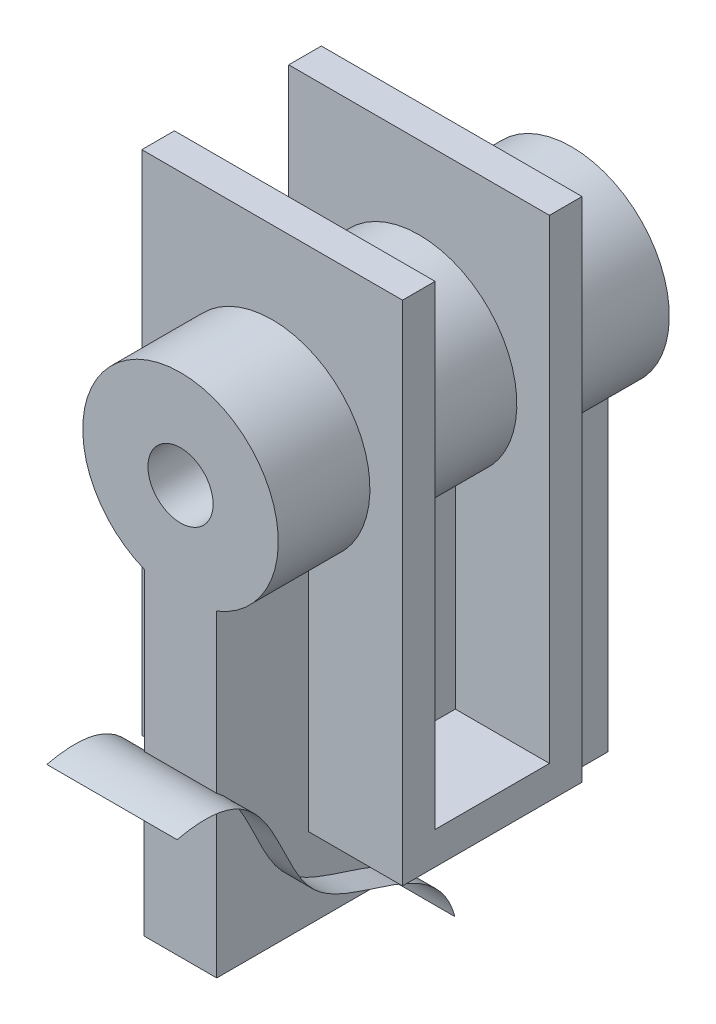
ISO-10303-21;
HEADER;
FILE_DESCRIPTION(('STEP AP214'),'2;1');
FILE_NAME('part.step','',(''),(''),'','','');
FILE_SCHEMA(('AUTOMOTIVE_DESIGN { 1 0 10303 214 1 1 1 1 }'));
ENDSEC;
DATA;
#1=APPLICATION_CONTEXT('core data for automotive mechanical design processes');
#2=APPLICATION_PROTOCOL_DEFINITION('international standard','automotive_design',2000,#1);
#3=PRODUCT_CONTEXT('',#1,'mechanical');
#4=PRODUCT('Part','Part','',(#3));
#5=PRODUCT_RELATED_PRODUCT_CATEGORY('part','',(#4));
#6=PRODUCT_DEFINITION_FORMATION('','',#4);
#7=PRODUCT_DEFINITION_CONTEXT('part definition',#1,'design');
#8=PRODUCT_DEFINITION('design','',#6,#7);
#9=PRODUCT_DEFINITION_SHAPE('','',#8);
#10=(LENGTH_UNIT() NAMED_UNIT(*) SI_UNIT(.MILLI.,.METRE.));
#11=(NAMED_UNIT(*) PLANE_ANGLE_UNIT() SI_UNIT($,.RADIAN.));
#12=(NAMED_UNIT(*) SI_UNIT($,.STERADIAN.) SOLID_ANGLE_UNIT());
#13=UNCERTAINTY_MEASURE_WITH_UNIT(LENGTH_MEASURE(1.E-05),#10,'distance_accuracy_value','');
#14=(GEOMETRIC_REPRESENTATION_CONTEXT(3) GLOBAL_UNCERTAINTY_ASSIGNED_CONTEXT((#13)) GLOBAL_UNIT_ASSIGNED_CONTEXT((#10,
#11,#12)) REPRESENTATION_CONTEXT('',''));
#15=CARTESIAN_POINT('',(0.,0.,0.));
#16=DIRECTION('',(0.,0.,1.));
#17=DIRECTION('',(1.,0.,0.));
#18=AXIS2_PLACEMENT_3D('',#15,#16,#17);
#19=CARTESIAN_POINT('',(0.,-36.8210870869659,40.5237731026121));
#20=CARTESIAN_POINT('',(0.,-33.3118553670702,25.1176072235687));
#21=CARTESIAN_POINT('',(0.,-61.7215890433346,26.7426652328646));
#22=CARTESIAN_POINT('',(0.,-57.8458147883083,0.702636395193637));
#23=CARTESIAN_POINT('',(0.,-68.3475748648418,-2.08737019533879));
#24=B_SPLINE_CURVE_WITH_KNOTS('',3,(#19,#20,#21,#22,#23),.UNSPECIFIED.,.F.,.F.,(4,1,4),(0.,
0.518621459530431,1.),.UNSPECIFIED.);
#25=DIRECTION('',(1.,0.,0.));
#26=VECTOR('',#25,1.);
#27=SURFACE_OF_LINEAR_EXTRUSION('',#24,#26);
#28=CARTESIAN_POINT('',(5.5776064521285,-36.8210870869659,40.5237731026121));
#29=CARTESIAN_POINT('',(5.5776064521285,-33.3118553670702,25.1176072235687));
#30=CARTESIAN_POINT('',(5.5776064521285,-61.7215890433346,26.7426652328646));
#31=CARTESIAN_POINT('',(5.5776064521285,-57.8458147883083,0.702636395193637));
#32=CARTESIAN_POINT('',(5.5776064521285,-68.3475748648418,-2.08737019533879));
#33=B_SPLINE_CURVE_WITH_KNOTS('',3,(#28,#29,#30,#31,#32),.UNSPECIFIED.,.F.,.F.,(4,1,4),(0.,
0.518621459530431,1.),.UNSPECIFIED.);
#34=CARTESIAN_POINT('',(5.5776064521285,-62.6622800075539,1.36688905202756));
#35=VERTEX_POINT('',#34);
#36=CARTESIAN_POINT('',(5.5776064521285,-38.1231716305938,30.02));
#37=VERTEX_POINT('',#36);
#38=EDGE_CURVE('E12',#35,#37,#33,.F.);
#39=ORIENTED_EDGE('',*,*,#38,.F.);
#40=DIRECTION('',(1.,0.,0.));
#41=VECTOR('',#40,1.);
#42=CARTESIAN_POINT('',(0.,-62.6622800075539,1.36688905202756));
#43=LINE('',#42,#41);
#44=CARTESIAN_POINT('',(-5.5776064521285,-62.6622800098763,1.36688904937728));
#45=VERTEX_POINT('',#44);
#46=EDGE_CURVE('E61',#45,#35,#43,.T.);
#47=ORIENTED_EDGE('',*,*,#46,.F.);
#48=CARTESIAN_POINT('',(-5.5776064521285,-36.8210870869659,40.5237731026121));
#49=CARTESIAN_POINT('',(-5.5776064521285,-33.3118553670702,25.1176072235687));
#50=CARTESIAN_POINT('',(-5.5776064521285,-61.7215890433346,26.7426652328646));
#51=CARTESIAN_POINT('',(-5.5776064521285,-57.8458147883083,0.702636395193637));
#52=CARTESIAN_POINT('',(-5.5776064521285,-68.3475748648418,-2.08737019533879));
#53=B_SPLINE_CURVE_WITH_KNOTS('',3,(#48,#49,#50,#51,#52),.UNSPECIFIED.,.F.,.F.,(4,1,4),(0.,
0.518621459530431,1.),.UNSPECIFIED.);
#54=CARTESIAN_POINT('',(-5.5776064521285,-38.1231716305938,30.02));
#55=VERTEX_POINT('',#54);
#56=EDGE_CURVE('E150',#55,#45,#53,.T.);
#57=ORIENTED_EDGE('',*,*,#56,.F.);
#58=DIRECTION('',(1.,0.,0.));
#59=VECTOR('',#58,1.);
#60=CARTESIAN_POINT('',(0.,-38.1231716305938,30.02));
#61=LINE('',#60,#59);
#62=EDGE_CURVE('E145',#37,#55,#61,.F.);
#63=ORIENTED_EDGE('',*,*,#62,.F.);
#64=EDGE_LOOP('',(#39,#47,#57,#63));
#65=FACE_BOUND('',#64,.T.);
#66=CARTESIAN_POINT('',(10.,-36.8210870869659,40.5237731026121));
#67=CARTESIAN_POINT('',(10.,-33.3118553670702,25.1176072235687));
#68=CARTESIAN_POINT('',(10.,-61.7215890433346,26.7426652328646));
#69=CARTESIAN_POINT('',(10.,-57.8458147883083,0.702636395193637));
#70=CARTESIAN_POINT('',(10.,-68.3475748648418,-2.08737019533879));
#71=B_SPLINE_CURVE_WITH_KNOTS('',3,(#66,#67,#68,#69,#70),.UNSPECIFIED.,.F.,.F.,(4,1,4),(0.,
0.518621459530431,1.),.UNSPECIFIED.);
#72=CARTESIAN_POINT('',(10.,-36.8210870869659,40.5237731026121));
#73=VERTEX_POINT('',#72);
#74=CARTESIAN_POINT('',(10.,-68.3475748648418,-2.08737019533879));
#75=VERTEX_POINT('',#74);
#76=EDGE_CURVE('E122',#73,#75,#71,.T.);
#77=ORIENTED_EDGE('',*,*,#76,.F.);
#78=DIRECTION('',(1.,0.,0.));
#79=VECTOR('',#78,1.);
#80=CARTESIAN_POINT('',(0.,-36.8210870869659,40.5237731026121));
#81=LINE('',#80,#79);
#82=CARTESIAN_POINT('',(-10.,-36.8210870869659,40.5237731026121));
#83=VERTEX_POINT('',#82);
#84=EDGE_CURVE('E137',#83,#73,#81,.T.);
#85=ORIENTED_EDGE('',*,*,#84,.F.);
#86=CARTESIAN_POINT('',(-10.,-36.8210870869659,40.5237731026121));
#87=CARTESIAN_POINT('',(-10.,-33.3118553670702,25.1176072235687));
#88=CARTESIAN_POINT('',(-10.,-61.7215890433346,26.7426652328646));
#89=CARTESIAN_POINT('',(-10.,-57.8458147883083,0.702636395193637));
#90=CARTESIAN_POINT('',(-10.,-68.3475748648418,-2.08737019533879));
#91=B_SPLINE_CURVE_WITH_KNOTS('',3,(#86,#87,#88,#89,#90),.UNSPECIFIED.,.F.,.F.,(4,1,4),(0.,
0.518621459530431,1.),.UNSPECIFIED.);
#92=CARTESIAN_POINT('',(-10.,-68.3475748648418,-2.08737019533879));
#93=VERTEX_POINT('',#92);
#94=EDGE_CURVE('E102',#83,#93,#91,.T.);
#95=ORIENTED_EDGE('',*,*,#94,.T.);
#96=DIRECTION('',(1.,0.,0.));
#97=VECTOR('',#96,1.);
#98=CARTESIAN_POINT('',(0.,-68.3475748648418,-2.08737019533879));
#99=LINE('',#98,#97);
#100=EDGE_CURVE('E138',#93,#75,#99,.T.);
#101=ORIENTED_EDGE('',*,*,#100,.T.);
#102=EDGE_LOOP('',(#77,#85,#95,#101));
#103=FACE_BOUND('',#102,.T.);
#104=ADVANCED_FACE('F53',(#65,#103),#27,.T.);
#105=CARTESIAN_POINT('',(5.5776064521285,-13.9324445279089,-30.));
#106=DIRECTION('',(1.,0.,0.));
#107=DIRECTION('',(0.,1.,0.));
#108=AXIS2_PLACEMENT_3D('',#105,#106,#107);
#109=PLANE('',#108);
#110=DIRECTION('',(0.,0.,1.));
#111=VECTOR('',#110,1.);
#112=CARTESIAN_POINT('',(5.5776064521285,-62.6622800075539,-30.));
#113=LINE('',#112,#111);
#114=CARTESIAN_POINT('',(5.5776064521285,-62.6622800075539,30.02));
#115=VERTEX_POINT('',#114);
#116=EDGE_CURVE('E95',#35,#115,#113,.T.);
#117=ORIENTED_EDGE('',*,*,#116,.F.);
#118=ORIENTED_EDGE('',*,*,#38,.T.);
#119=DIRECTION('',(0.,1.,0.));
#120=VECTOR('',#119,1.);
#121=CARTESIAN_POINT('',(5.5776064521285,0.,30.02));
#122=LINE('',#121,#120);
#123=EDGE_CURVE('E110',#115,#37,#122,.T.);
#124=ORIENTED_EDGE('',*,*,#123,.F.);
#125=EDGE_LOOP('',(#117,#118,#124));
#126=FACE_BOUND('',#125,.T.);
#127=ADVANCED_FACE('F114',(#126),#109,.T.);
#128=CARTESIAN_POINT('',(-5.5576064521285,-62.6622800075539,-30.));
#129=DIRECTION('',(0.,-1.,0.));
#130=DIRECTION('',(0.,0.,-1.));
#131=AXIS2_PLACEMENT_3D('',#128,#129,#130);
#132=PLANE('',#131);
#133=DIRECTION('',(0.,0.,1.));
#134=VECTOR('',#133,1.);
#135=CARTESIAN_POINT('',(-5.5776064521285,-62.6622800075539,-30.));
#136=LINE('',#135,#134);
#137=CARTESIAN_POINT('',(-5.5776064521285,-62.6622800075539,30.02));
#138=VERTEX_POINT('',#137);
#139=EDGE_CURVE('E103',#45,#138,#136,.T.);
#140=ORIENTED_EDGE('',*,*,#139,.F.);
#141=ORIENTED_EDGE('',*,*,#46,.T.);
#142=ORIENTED_EDGE('',*,*,#116,.T.);
#143=DIRECTION('',(1.,0.,0.));
#144=VECTOR('',#143,1.);
#145=CARTESIAN_POINT('',(0.,-62.6622800075539,30.02));
#146=LINE('',#145,#144);
#147=EDGE_CURVE('E99',#138,#115,#146,.T.);
#148=ORIENTED_EDGE('',*,*,#147,.F.);
#149=EDGE_LOOP('',(#140,#141,#142,#148));
#150=FACE_BOUND('',#149,.T.);
#151=ADVANCED_FACE('F98',(#150),#132,.T.);
#152=CARTESIAN_POINT('',(-5.5776064521285,-13.9324445279089,-30.));
#153=DIRECTION('',(-1.,0.,0.));
#154=DIRECTION('',(0.,0.,1.));
#155=AXIS2_PLACEMENT_3D('',#152,#153,#154);
#156=PLANE('',#155);
#157=DIRECTION('',(0.,-1.,0.));
#158=VECTOR('',#157,1.);
#159=CARTESIAN_POINT('',(-5.5776064521285,0.,30.02));
#160=LINE('',#159,#158);
#161=EDGE_CURVE('E112',#55,#138,#160,.T.);
#162=ORIENTED_EDGE('',*,*,#161,.F.);
#163=ORIENTED_EDGE('',*,*,#56,.T.);
#164=ORIENTED_EDGE('',*,*,#139,.T.);
#165=EDGE_LOOP('',(#162,#163,#164));
#166=FACE_BOUND('',#165,.T.);
#167=ADVANCED_FACE('F157',(#166),#156,.T.);
#168=CARTESIAN_POINT('',(0.,0.,30.02));
#169=DIRECTION('',(0.,0.,1.));
#170=DIRECTION('',(1.,0.,0.));
#171=AXIS2_PLACEMENT_3D('',#168,#169,#170);
#172=PLANE('',#171);
#173=ORIENTED_EDGE('',*,*,#123,.T.);
#174=ORIENTED_EDGE('',*,*,#62,.T.);
#175=ORIENTED_EDGE('',*,*,#161,.T.);
#176=ORIENTED_EDGE('',*,*,#147,.T.);
#177=EDGE_LOOP('',(#173,#174,#175,#176));
#178=FACE_BOUND('',#177,.T.);
#179=ADVANCED_FACE('F108',(#178),#172,.T.);
#180=OPEN_SHELL('',(#104,#127,#151,#167,#179));
#181=SHELL_BASED_SURFACE_MODEL('B2',(#180));
#182=CARTESIAN_POINT('',(-20.,-45.2531458099855,-6.6055019568257));
#183=DIRECTION('',(0.,1.,0.));
#184=DIRECTION('',(0.,0.,1.));
#185=AXIS2_PLACEMENT_3D('',#182,#183,#184);
#186=PLANE('',#185);
#187=DIRECTION('',(1.,0.,0.));
#188=VECTOR('',#187,1.);
#189=CARTESIAN_POINT('',(-20.,-45.2531458099855,10.9381302617935));
#190=LINE('',#189,#188);
#191=CARTESIAN_POINT('',(-20.,-45.2531458099855,10.9381302617935));
#192=VERTEX_POINT('',#191);
#193=CARTESIAN_POINT('',(20.,-45.2531458099855,10.9381302617935));
#194=VERTEX_POINT('',#193);
#195=EDGE_CURVE('E229',#192,#194,#190,.T.);
#196=ORIENTED_EDGE('',*,*,#195,.T.);
#197=DIRECTION('',(0.,0.,1.));
#198=VECTOR('',#197,1.);
#199=CARTESIAN_POINT('',(20.,-45.2531458099855,-6.6055019568257));
#200=LINE('',#199,#198);
#201=CARTESIAN_POINT('',(20.,-45.2531458099855,-6.6055019568257));
#202=VERTEX_POINT('',#201);
#203=EDGE_CURVE('E290',#202,#194,#200,.T.);
#204=ORIENTED_EDGE('',*,*,#203,.F.);
#205=DIRECTION('',(1.,0.,0.));
#206=VECTOR('',#205,1.);
#207=CARTESIAN_POINT('',(-20.,-45.2531458099855,-6.6055019568257));
#208=LINE('',#207,#206);
#209=CARTESIAN_POINT('',(-20.,-45.2531458099855,-6.6055019568257));
#210=VERTEX_POINT('',#209);
#211=EDGE_CURVE('E51',#210,#202,#208,.T.);
#212=ORIENTED_EDGE('',*,*,#211,.F.);
#213=DIRECTION('',(0.,0.,1.));
#214=VECTOR('',#213,1.);
#215=CARTESIAN_POINT('',(-20.,-45.2531458099855,-6.6055019568257));
#216=LINE('',#215,#214);
#217=EDGE_CURVE('E291',#210,#192,#216,.T.);
#218=ORIENTED_EDGE('',*,*,#217,.T.);
#219=EDGE_LOOP('',(#196,#204,#212,#218));
#220=FACE_BOUND('',#219,.T.);
#221=ADVANCED_FACE('F226',(#220),#186,.T.);
#222=CARTESIAN_POINT('',(-20.,-45.2531458099855,-6.6055019568257));
#223=DIRECTION('',(0.,0.,1.));
#224=DIRECTION('',(1.,0.,0.));
#225=AXIS2_PLACEMENT_3D('',#222,#223,#224);
#226=PLANE('',#225);
#227=ORIENTED_EDGE('',*,*,#211,.T.);
#228=DIRECTION('',(0.,-1.,0.));
#229=VECTOR('',#228,1.);
#230=CARTESIAN_POINT('',(20.,-45.2531458099855,-6.6055019568257));
#231=LINE('',#230,#229);
#232=CARTESIAN_POINT('',(20.,27.5804653060911,-6.6055019568257));
#233=VERTEX_POINT('',#232);
#234=EDGE_CURVE('E308',#233,#202,#231,.T.);
#235=ORIENTED_EDGE('',*,*,#234,.F.);
#236=DIRECTION('',(1.,0.,0.));
#237=VECTOR('',#236,1.);
#238=CARTESIAN_POINT('',(-20.,27.5804653060911,-6.6055019568257));
#239=LINE('',#238,#237);
#240=CARTESIAN_POINT('',(-20.,27.5804653060911,-6.6055019568257));
#241=VERTEX_POINT('',#240);
#242=EDGE_CURVE('E234',#241,#233,#239,.T.);
#243=ORIENTED_EDGE('',*,*,#242,.F.);
#244=DIRECTION('',(0.,-1.,0.));
#245=VECTOR('',#244,1.);
#246=CARTESIAN_POINT('',(-20.,-45.2531458099855,-6.6055019568257));
#247=LINE('',#246,#245);
#248=EDGE_CURVE('E296',#241,#210,#247,.T.);
#249=ORIENTED_EDGE('',*,*,#248,.T.);
#250=EDGE_LOOP('',(#227,#235,#243,#249));
#251=FACE_BOUND('',#250,.T.);
#252=ADVANCED_FACE('F372',(#251),#226,.T.);
#253=CARTESIAN_POINT('',(-20.,27.5804653060911,-6.6055019568257));
#254=DIRECTION('',(0.,1.,0.));
#255=DIRECTION('',(0.,0.,1.));
#256=AXIS2_PLACEMENT_3D('',#253,#254,#255);
#257=PLANE('',#256);
#258=ORIENTED_EDGE('',*,*,#242,.T.);
#259=DIRECTION('',(0.,0.,1.));
#260=VECTOR('',#259,1.);
#261=CARTESIAN_POINT('',(20.,27.5804653060911,-6.6055019568257));
#262=LINE('',#261,#260);
#263=CARTESIAN_POINT('',(20.,27.5804653060911,-11.6055019568257));
#264=VERTEX_POINT('',#263);
#265=EDGE_CURVE('E321',#264,#233,#262,.T.);
#266=ORIENTED_EDGE('',*,*,#265,.F.);
#267=DIRECTION('',(1.,0.,0.));
#268=VECTOR('',#267,1.);
#269=CARTESIAN_POINT('',(-20.,27.5804653060911,-11.6055019568257));
#270=LINE('',#269,#268);
#271=CARTESIAN_POINT('',(-20.,27.5804653060911,-11.6055019568257));
#272=VERTEX_POINT('',#271);
#273=EDGE_CURVE('E343',#272,#264,#270,.T.);
#274=ORIENTED_EDGE('',*,*,#273,.F.);
#275=DIRECTION('',(0.,0.,1.));
#276=VECTOR('',#275,1.);
#277=CARTESIAN_POINT('',(-20.,27.5804653060911,-6.6055019568257));
#278=LINE('',#277,#276);
#279=EDGE_CURVE('E339',#272,#241,#278,.T.);
#280=ORIENTED_EDGE('',*,*,#279,.T.);
#281=EDGE_LOOP('',(#258,#266,#274,#280));
#282=FACE_BOUND('',#281,.T.);
#283=ADVANCED_FACE('F371',(#282),#257,.T.);
#284=CARTESIAN_POINT('',(-20.,-50.2531458099855,-11.6055019568257));
#285=DIRECTION('',(0.,0.,-1.));
#286=DIRECTION('',(-1.,0.,0.));
#287=AXIS2_PLACEMENT_3D('',#284,#285,#286);
#288=PLANE('',#287);
#289=ORIENTED_EDGE('',*,*,#273,.T.);
#290=DIRECTION('',(0.,1.,0.));
#291=VECTOR('',#290,1.);
#292=CARTESIAN_POINT('',(20.,-50.2531458099855,-11.6055019568257));
#293=LINE('',#292,#291);
#294=CARTESIAN_POINT('',(20.,-50.2531458099855,-11.6055019568257));
#295=VERTEX_POINT('',#294);
#296=EDGE_CURVE('E318',#295,#264,#293,.T.);
#297=ORIENTED_EDGE('',*,*,#296,.F.);
#298=DIRECTION('',(1.,0.,0.));
#299=VECTOR('',#298,1.);
#300=CARTESIAN_POINT('',(-20.,-50.2531458099855,-11.6055019568257));
#301=LINE('',#300,#299);
#302=CARTESIAN_POINT('',(-20.,-50.2531458099855,-11.6055019568257));
#303=VERTEX_POINT('',#302);
#304=EDGE_CURVE('E345',#303,#295,#301,.T.);
#305=ORIENTED_EDGE('',*,*,#304,.F.);
#306=DIRECTION('',(0.,1.,0.));
#307=VECTOR('',#306,1.);
#308=CARTESIAN_POINT('',(-20.,-50.2531458099855,-11.6055019568257));
#309=LINE('',#308,#307);
#310=EDGE_CURVE('E336',#303,#272,#309,.T.);
#311=ORIENTED_EDGE('',*,*,#310,.T.);
#312=EDGE_LOOP('',(#289,#297,#305,#311));
#313=FACE_BOUND('',#312,.T.);
#314=ADVANCED_FACE('F367',(#313),#288,.T.);
#315=CARTESIAN_POINT('',(-20.,-50.2531458099855,-11.6055019568257));
#316=DIRECTION('',(0.,-1.,0.));
#317=DIRECTION('',(0.,0.,-1.));
#318=AXIS2_PLACEMENT_3D('',#315,#316,#317);
#319=PLANE('',#318);
#320=ORIENTED_EDGE('',*,*,#304,.T.);
#321=DIRECTION('',(0.,0.,-1.));
#322=VECTOR('',#321,1.);
#323=CARTESIAN_POINT('',(20.,-50.2531458099855,-11.6055019568257));
#324=LINE('',#323,#322);
#325=CARTESIAN_POINT('',(20.,-50.2531458099855,15.9381302617935));
#326=VERTEX_POINT('',#325);
#327=EDGE_CURVE('E315',#326,#295,#324,.T.);
#328=ORIENTED_EDGE('',*,*,#327,.F.);
#329=DIRECTION('',(1.,0.,0.));
#330=VECTOR('',#329,1.);
#331=CARTESIAN_POINT('',(-20.,-50.2531458099855,15.9381302617935));
#332=LINE('',#331,#330);
#333=CARTESIAN_POINT('',(-20.,-50.2531458099855,15.9381302617935));
#334=VERTEX_POINT('',#333);
#335=EDGE_CURVE('E347',#334,#326,#332,.T.);
#336=ORIENTED_EDGE('',*,*,#335,.F.);
#337=DIRECTION('',(0.,0.,-1.));
#338=VECTOR('',#337,1.);
#339=CARTESIAN_POINT('',(-20.,-50.2531458099855,-11.6055019568257));
#340=LINE('',#339,#338);
#341=EDGE_CURVE('E333',#334,#303,#340,.T.);
#342=ORIENTED_EDGE('',*,*,#341,.T.);
#343=EDGE_LOOP('',(#320,#328,#336,#342));
#344=FACE_BOUND('',#343,.T.);
#345=ADVANCED_FACE('F360',(#344),#319,.T.);
#346=CARTESIAN_POINT('',(-20.,-50.2531458099855,15.9381302617935));
#347=DIRECTION('',(0.,0.,1.));
#348=DIRECTION('',(1.,0.,0.));
#349=AXIS2_PLACEMENT_3D('',#346,#347,#348);
#350=PLANE('',#349);
#351=ORIENTED_EDGE('',*,*,#335,.T.);
#352=DIRECTION('',(0.,-1.,0.));
#353=VECTOR('',#352,1.);
#354=CARTESIAN_POINT('',(20.,-50.2531458099855,15.9381302617935));
#355=LINE('',#354,#353);
#356=CARTESIAN_POINT('',(20.,27.5804653060911,15.9381302617935));
#357=VERTEX_POINT('',#356);
#358=EDGE_CURVE('E312',#357,#326,#355,.T.);
#359=ORIENTED_EDGE('',*,*,#358,.F.);
#360=DIRECTION('',(1.,0.,0.));
#361=VECTOR('',#360,1.);
#362=CARTESIAN_POINT('',(-20.,27.5804653060911,15.9381302617935));
#363=LINE('',#362,#361);
#364=CARTESIAN_POINT('',(-20.,27.5804653060911,15.9381302617935));
#365=VERTEX_POINT('',#364);
#366=EDGE_CURVE('E349',#365,#357,#363,.T.);
#367=ORIENTED_EDGE('',*,*,#366,.F.);
#368=DIRECTION('',(0.,-1.,0.));
#369=VECTOR('',#368,1.);
#370=CARTESIAN_POINT('',(-20.,-50.2531458099855,15.9381302617935));
#371=LINE('',#370,#369);
#372=EDGE_CURVE('E330',#365,#334,#371,.T.);
#373=ORIENTED_EDGE('',*,*,#372,.T.);
#374=EDGE_LOOP('',(#351,#359,#367,#373));
#375=FACE_BOUND('',#374,.T.);
#376=ADVANCED_FACE('F357',(#375),#350,.T.);
#377=CARTESIAN_POINT('',(-20.,27.5804653060911,15.9381302617935));
#378=DIRECTION('',(0.,1.,0.));
#379=DIRECTION('',(0.,0.,1.));
#380=AXIS2_PLACEMENT_3D('',#377,#378,#379);
#381=PLANE('',#380);
#382=ORIENTED_EDGE('',*,*,#366,.T.);
#383=DIRECTION('',(0.,0.,1.));
#384=VECTOR('',#383,1.);
#385=CARTESIAN_POINT('',(20.,27.5804653060911,15.9381302617935));
#386=LINE('',#385,#384);
#387=CARTESIAN_POINT('',(20.,27.5804653060911,10.9381302617935));
#388=VERTEX_POINT('',#387);
#389=EDGE_CURVE('E303',#388,#357,#386,.T.);
#390=ORIENTED_EDGE('',*,*,#389,.F.);
#391=DIRECTION('',(1.,0.,0.));
#392=VECTOR('',#391,1.);
#393=CARTESIAN_POINT('',(-20.,27.5804653060911,10.9381302617935));
#394=LINE('',#393,#392);
#395=CARTESIAN_POINT('',(-20.,27.5804653060911,10.9381302617935));
#396=VERTEX_POINT('',#395);
#397=EDGE_CURVE('E295',#396,#388,#394,.T.);
#398=ORIENTED_EDGE('',*,*,#397,.F.);
#399=DIRECTION('',(0.,0.,1.));
#400=VECTOR('',#399,1.);
#401=CARTESIAN_POINT('',(-20.,27.5804653060911,15.9381302617935));
#402=LINE('',#401,#400);
#403=EDGE_CURVE('E327',#396,#365,#402,.T.);
#404=ORIENTED_EDGE('',*,*,#403,.T.);
#405=EDGE_LOOP('',(#382,#390,#398,#404));
#406=FACE_BOUND('',#405,.T.);
#407=ADVANCED_FACE('F351',(#406),#381,.T.);
#408=CARTESIAN_POINT('',(-20.,-45.2531458099855,10.9381302617935));
#409=DIRECTION('',(0.,0.,-1.));
#410=DIRECTION('',(-1.,0.,0.));
#411=AXIS2_PLACEMENT_3D('',#408,#409,#410);
#412=PLANE('',#411);
#413=ORIENTED_EDGE('',*,*,#397,.T.);
#414=DIRECTION('',(0.,1.,0.));
#415=VECTOR('',#414,1.);
#416=CARTESIAN_POINT('',(20.,-45.2531458099855,10.9381302617935));
#417=LINE('',#416,#415);
#418=EDGE_CURVE('E298',#194,#388,#417,.T.);
#419=ORIENTED_EDGE('',*,*,#418,.F.);
#420=ORIENTED_EDGE('',*,*,#195,.F.);
#421=DIRECTION('',(0.,1.,0.));
#422=VECTOR('',#421,1.);
#423=CARTESIAN_POINT('',(-20.,-45.2531458099855,10.9381302617935));
#424=LINE('',#423,#422);
#425=EDGE_CURVE('E325',#192,#396,#424,.T.);
#426=ORIENTED_EDGE('',*,*,#425,.T.);
#427=EDGE_LOOP('',(#413,#419,#420,#426));
#428=FACE_BOUND('',#427,.T.);
#429=ADVANCED_FACE('F299',(#428),#412,.T.);
#430=CARTESIAN_POINT('',(-20.,0.,-70.));
#431=DIRECTION('',(-1.,0.,0.));
#432=DIRECTION('',(0.,0.,1.));
#433=AXIS2_PLACEMENT_3D('',#430,#431,#432);
#434=PLANE('',#433);
#435=ORIENTED_EDGE('',*,*,#217,.F.);
#436=ORIENTED_EDGE('',*,*,#248,.F.);
#437=ORIENTED_EDGE('',*,*,#279,.F.);
#438=ORIENTED_EDGE('',*,*,#310,.F.);
#439=ORIENTED_EDGE('',*,*,#341,.F.);
#440=ORIENTED_EDGE('',*,*,#372,.F.);
#441=ORIENTED_EDGE('',*,*,#403,.F.);
#442=ORIENTED_EDGE('',*,*,#425,.F.);
#443=EDGE_LOOP('',(#435,#436,#437,#438,#439,#440,#441,#442));
#444=FACE_BOUND('',#443,.T.);
#445=ADVANCED_FACE('F363',(#444),#434,.T.);
#446=CARTESIAN_POINT('',(20.,0.,-70.));
#447=DIRECTION('',(-1.,0.,0.));
#448=DIRECTION('',(0.,0.,1.));
#449=AXIS2_PLACEMENT_3D('',#446,#447,#448);
#450=PLANE('',#449);
#451=ORIENTED_EDGE('',*,*,#203,.T.);
#452=ORIENTED_EDGE('',*,*,#418,.T.);
#453=ORIENTED_EDGE('',*,*,#389,.T.);
#454=ORIENTED_EDGE('',*,*,#358,.T.);
#455=ORIENTED_EDGE('',*,*,#327,.T.);
#456=ORIENTED_EDGE('',*,*,#296,.T.);
#457=ORIENTED_EDGE('',*,*,#265,.T.);
#458=ORIENTED_EDGE('',*,*,#234,.T.);
#459=EDGE_LOOP('',(#451,#452,#453,#454,#455,#456,#457,#458));
#460=FACE_BOUND('',#459,.T.);
#461=ADVANCED_FACE('F306',(#460),#450,.F.);
#462=CLOSED_SHELL('',(#221,#252,#283,#314,#345,#376,#407,#429,#445,#461));
#463=MANIFOLD_SOLID_BREP('B6',#462);
#464=CARTESIAN_POINT('',(0.,0.,-30.));
#465=DIRECTION('',(0.,0.,1.));
#466=DIRECTION('',(1.,0.,0.));
#467=AXIS2_PLACEMENT_3D('',#464,#465,#466);
#468=CYLINDRICAL_SURFACE('',#467,15.);
#469=DIRECTION('',(0.,0.,1.));
#470=VECTOR('',#469,1.);
#471=CARTESIAN_POINT('',(-5.5576064521285,-13.9324445279089,-30.));
#472=LINE('',#471,#470);
#473=CARTESIAN_POINT('',(-5.5576064521285,-13.9324445279089,-30.));
#474=VERTEX_POINT('',#473);
#475=CARTESIAN_POINT('',(-5.5576064521285,-13.9324445279089,30.));
#476=VERTEX_POINT('',#475);
#477=EDGE_CURVE('E456',#474,#476,#472,.T.);
#478=ORIENTED_EDGE('',*,*,#477,.T.);
#479=CARTESIAN_POINT('',(0.,0.,30.));
#480=DIRECTION('',(0.,0.,1.));
#481=DIRECTION('',(1.,0.,0.));
#482=AXIS2_PLACEMENT_3D('',#479,#480,#481);
#483=CIRCLE('',#482,15.);
#484=CARTESIAN_POINT('',(5.5576064521285,-13.9324445279089,30.));
#485=VERTEX_POINT('',#484);
#486=EDGE_CURVE('E493',#485,#476,#483,.T.);
#487=ORIENTED_EDGE('',*,*,#486,.F.);
#488=DIRECTION('',(0.,0.,1.));
#489=VECTOR('',#488,1.);
#490=CARTESIAN_POINT('',(5.5576064521285,-13.9324445279089,-30.));
#491=LINE('',#490,#489);
#492=CARTESIAN_POINT('',(5.5576064521285,-13.9324445279089,-30.));
#493=VERTEX_POINT('',#492);
#494=EDGE_CURVE('E224',#493,#485,#491,.T.);
#495=ORIENTED_EDGE('',*,*,#494,.F.);
#496=CARTESIAN_POINT('',(0.,0.,-30.));
#497=DIRECTION('',(0.,0.,1.));
#498=DIRECTION('',(1.,0.,0.));
#499=AXIS2_PLACEMENT_3D('',#496,#497,#498);
#500=CIRCLE('',#499,15.);
#501=EDGE_CURVE('E494',#493,#474,#500,.T.);
#502=ORIENTED_EDGE('',*,*,#501,.T.);
#503=EDGE_LOOP('',(#478,#487,#495,#502));
#504=FACE_BOUND('',#503,.T.);
#505=ADVANCED_FACE('F453',(#504),#468,.T.);
#506=CARTESIAN_POINT('',(5.5576064521285,-13.9324445279089,-30.));
#507=DIRECTION('',(1.,0.,0.));
#508=DIRECTION('',(0.,1.,0.));
#509=AXIS2_PLACEMENT_3D('',#506,#507,#508);
#510=PLANE('',#509);
#511=ORIENTED_EDGE('',*,*,#494,.T.);
#512=DIRECTION('',(0.,1.,0.));
#513=VECTOR('',#512,1.);
#514=CARTESIAN_POINT('',(5.5576064521285,-13.9324445279089,30.));
#515=LINE('',#514,#513);
#516=CARTESIAN_POINT('',(5.5576064521285,-62.6422800075539,30.));
#517=VERTEX_POINT('',#516);
#518=EDGE_CURVE('E511',#517,#485,#515,.T.);
#519=ORIENTED_EDGE('',*,*,#518,.F.);
#520=DIRECTION('',(0.,0.,1.));
#521=VECTOR('',#520,1.);
#522=CARTESIAN_POINT('',(5.5576064521285,-62.6422800075539,-30.));
#523=LINE('',#522,#521);
#524=CARTESIAN_POINT('',(5.5576064521285,-62.6422800075539,-30.));
#525=VERTEX_POINT('',#524);
#526=EDGE_CURVE('E461',#525,#517,#523,.T.);
#527=ORIENTED_EDGE('',*,*,#526,.F.);
#528=DIRECTION('',(0.,1.,0.));
#529=VECTOR('',#528,1.);
#530=CARTESIAN_POINT('',(5.5576064521285,-13.9324445279089,-30.));
#531=LINE('',#530,#529);
#532=EDGE_CURVE('E499',#525,#493,#531,.T.);
#533=ORIENTED_EDGE('',*,*,#532,.T.);
#534=EDGE_LOOP('',(#511,#519,#527,#533));
#535=FACE_BOUND('',#534,.T.);
#536=ADVANCED_FACE('F532',(#535),#510,.T.);
#537=CARTESIAN_POINT('',(-5.5576064521285,-62.6422800075539,-30.));
#538=DIRECTION('',(0.,-1.,0.));
#539=DIRECTION('',(0.,0.,-1.));
#540=AXIS2_PLACEMENT_3D('',#537,#538,#539);
#541=PLANE('',#540);
#542=ORIENTED_EDGE('',*,*,#526,.T.);
#543=DIRECTION('',(1.,0.,0.));
#544=VECTOR('',#543,1.);
#545=CARTESIAN_POINT('',(-5.5576064521285,-62.6422800075539,30.));
#546=LINE('',#545,#544);
#547=CARTESIAN_POINT('',(-5.5576064521285,-62.6422800075539,30.));
#548=VERTEX_POINT('',#547);
#549=EDGE_CURVE('E506',#548,#517,#546,.T.);
#550=ORIENTED_EDGE('',*,*,#549,.F.);
#551=DIRECTION('',(0.,0.,1.));
#552=VECTOR('',#551,1.);
#553=CARTESIAN_POINT('',(-5.5576064521285,-62.6422800075539,-30.));
#554=LINE('',#553,#552);
#555=CARTESIAN_POINT('',(-5.5576064521285,-62.6422800075539,-30.));
#556=VERTEX_POINT('',#555);
#557=EDGE_CURVE('E498',#556,#548,#554,.T.);
#558=ORIENTED_EDGE('',*,*,#557,.F.);
#559=DIRECTION('',(1.,0.,0.));
#560=VECTOR('',#559,1.);
#561=CARTESIAN_POINT('',(-5.5576064521285,-62.6422800075539,-30.));
#562=LINE('',#561,#560);
#563=EDGE_CURVE('E525',#556,#525,#562,.T.);
#564=ORIENTED_EDGE('',*,*,#563,.T.);
#565=EDGE_LOOP('',(#542,#550,#558,#564));
#566=FACE_BOUND('',#565,.T.);
#567=ADVANCED_FACE('F529',(#566),#541,.T.);
#568=CARTESIAN_POINT('',(-5.5576064521285,-13.9324445279089,-30.));
#569=DIRECTION('',(-1.,0.,0.));
#570=DIRECTION('',(0.,0.,1.));
#571=AXIS2_PLACEMENT_3D('',#568,#569,#570);
#572=PLANE('',#571);
#573=ORIENTED_EDGE('',*,*,#557,.T.);
#574=DIRECTION('',(0.,-1.,0.));
#575=VECTOR('',#574,1.);
#576=CARTESIAN_POINT('',(-5.5576064521285,-13.9324445279089,30.));
#577=LINE('',#576,#575);
#578=EDGE_CURVE('E501',#476,#548,#577,.T.);
#579=ORIENTED_EDGE('',*,*,#578,.F.);
#580=ORIENTED_EDGE('',*,*,#477,.F.);
#581=DIRECTION('',(0.,-1.,0.));
#582=VECTOR('',#581,1.);
#583=CARTESIAN_POINT('',(-5.5576064521285,-13.9324445279089,-30.));
#584=LINE('',#583,#582);
#585=EDGE_CURVE('E523',#474,#556,#584,.T.);
#586=ORIENTED_EDGE('',*,*,#585,.T.);
#587=EDGE_LOOP('',(#573,#579,#580,#586));
#588=FACE_BOUND('',#587,.T.);
#589=ADVANCED_FACE('F502',(#588),#572,.T.);
#590=CARTESIAN_POINT('',(0.,0.,-30.));
#591=DIRECTION('',(0.,0.,1.));
#592=DIRECTION('',(1.,0.,0.));
#593=AXIS2_PLACEMENT_3D('',#590,#591,#592);
#594=PLANE('',#593);
#595=CARTESIAN_POINT('',(0.,0.,-30.));
#596=DIRECTION('',(0.,0.,1.));
#597=DIRECTION('',(1.,0.,0.));
#598=AXIS2_PLACEMENT_3D('',#595,#596,#597);
#599=CIRCLE('',#598,5.);
#600=CARTESIAN_POINT('',(5.,0.,-30.));
#601=VERTEX_POINT('',#600);
#602=EDGE_CURVE('E519',#601,#601,#599,.T.);
#603=ORIENTED_EDGE('',*,*,#602,.T.);
#604=EDGE_LOOP('',(#603));
#605=FACE_BOUND('',#604,.T.);
#606=ORIENTED_EDGE('',*,*,#501,.F.);
#607=ORIENTED_EDGE('',*,*,#532,.F.);
#608=ORIENTED_EDGE('',*,*,#563,.F.);
#609=ORIENTED_EDGE('',*,*,#585,.F.);
#610=EDGE_LOOP('',(#606,#607,#608,#609));
#611=FACE_BOUND('',#610,.T.);
#612=ADVANCED_FACE('F534',(#605,#611),#594,.F.);
#613=CARTESIAN_POINT('',(0.,0.,-30.));
#614=DIRECTION('',(0.,0.,1.));
#615=DIRECTION('',(1.,0.,0.));
#616=AXIS2_PLACEMENT_3D('',#613,#614,#615);
#617=CYLINDRICAL_SURFACE('',#616,5.);
#618=ORIENTED_EDGE('',*,*,#602,.F.);
#619=EDGE_LOOP('',(#618));
#620=FACE_BOUND('',#619,.T.);
#621=CARTESIAN_POINT('',(0.,0.,30.));
#622=DIRECTION('',(0.,0.,1.));
#623=DIRECTION('',(1.,0.,0.));
#624=AXIS2_PLACEMENT_3D('',#621,#622,#623);
#625=CIRCLE('',#624,5.);
#626=CARTESIAN_POINT('',(5.,0.,30.));
#627=VERTEX_POINT('',#626);
#628=EDGE_CURVE('E512',#627,#627,#625,.T.);
#629=ORIENTED_EDGE('',*,*,#628,.T.);
#630=EDGE_LOOP('',(#629));
#631=FACE_BOUND('',#630,.T.);
#632=ADVANCED_FACE('F536',(#620,#631),#617,.F.);
#633=CARTESIAN_POINT('',(0.,0.,30.));
#634=DIRECTION('',(0.,0.,1.));
#635=DIRECTION('',(1.,0.,0.));
#636=AXIS2_PLACEMENT_3D('',#633,#634,#635);
#637=PLANE('',#636);
#638=ORIENTED_EDGE('',*,*,#486,.T.);
#639=ORIENTED_EDGE('',*,*,#578,.T.);
#640=ORIENTED_EDGE('',*,*,#549,.T.);
#641=ORIENTED_EDGE('',*,*,#518,.T.);
#642=EDGE_LOOP('',(#638,#639,#640,#641));
#643=FACE_BOUND('',#642,.T.);
#644=ORIENTED_EDGE('',*,*,#628,.F.);
#645=EDGE_LOOP('',(#644));
#646=FACE_BOUND('',#645,.T.);
#647=ADVANCED_FACE('F509',(#643,#646),#637,.T.);
#648=CLOSED_SHELL('',(#505,#536,#567,#589,#612,#632,#647));
#649=MANIFOLD_SOLID_BREP('B45_NOT_SHOWN',#648);
#650=ADVANCED_BREP_SHAPE_REPRESENTATION('',(#18,#463,#649),#14);
#651=MANIFOLD_SURFACE_SHAPE_REPRESENTATION('',(#18,#181),#14);
#652=SHAPE_REPRESENTATION('',(#18),#14);
#653=SHAPE_DEFINITION_REPRESENTATION(#9,#652);
#654=SHAPE_REPRESENTATION_RELATIONSHIP('','',#652,#650);
#655=SHAPE_REPRESENTATION_RELATIONSHIP('','',#652,#651);
ENDSEC;
END-ISO-10303-21;
